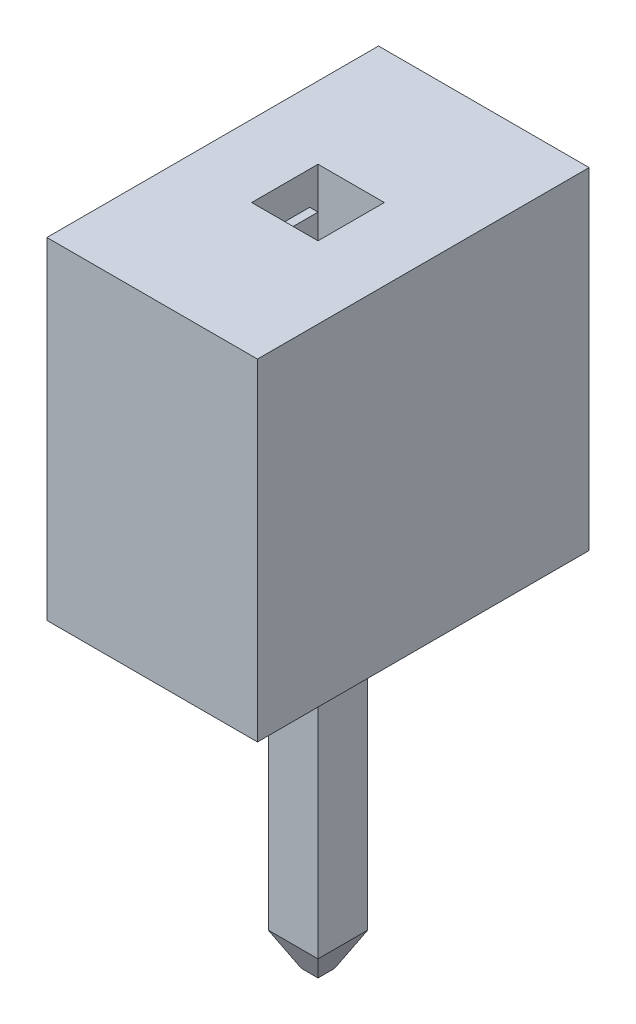
ISO-10303-21;
HEADER;
FILE_DESCRIPTION(('STEP AP214'),'2;1');
FILE_NAME('part.step','',(''),(''),'','','');
FILE_SCHEMA(('AUTOMOTIVE_DESIGN { 1 0 10303 214 1 1 1 1 }'));
ENDSEC;
DATA;
#1=APPLICATION_CONTEXT('core data for automotive mechanical design processes');
#2=APPLICATION_PROTOCOL_DEFINITION('international standard','automotive_design',2000,#1);
#3=PRODUCT_CONTEXT('',#1,'mechanical');
#4=PRODUCT('Part','Part','',(#3));
#5=PRODUCT_RELATED_PRODUCT_CATEGORY('part','',(#4));
#6=PRODUCT_DEFINITION_FORMATION('','',#4);
#7=PRODUCT_DEFINITION_CONTEXT('part definition',#1,'design');
#8=PRODUCT_DEFINITION('design','',#6,#7);
#9=PRODUCT_DEFINITION_SHAPE('','',#8);
#10=(LENGTH_UNIT() NAMED_UNIT(*) SI_UNIT(.MILLI.,.METRE.));
#11=(NAMED_UNIT(*) PLANE_ANGLE_UNIT() SI_UNIT($,.RADIAN.));
#12=(NAMED_UNIT(*) SI_UNIT($,.STERADIAN.) SOLID_ANGLE_UNIT());
#13=UNCERTAINTY_MEASURE_WITH_UNIT(LENGTH_MEASURE(1.E-05),#10,'distance_accuracy_value','');
#14=(GEOMETRIC_REPRESENTATION_CONTEXT(3) GLOBAL_UNCERTAINTY_ASSIGNED_CONTEXT((#13)) GLOBAL_UNIT_ASSIGNED_CONTEXT((#10,
#11,#12)) REPRESENTATION_CONTEXT('',''));
#15=CARTESIAN_POINT('',(0.,0.,0.));
#16=DIRECTION('',(0.,0.,1.));
#17=DIRECTION('',(1.,0.,0.));
#18=AXIS2_PLACEMENT_3D('',#15,#16,#17);
#19=CARTESIAN_POINT('',(0.,0.,0.));
#20=DIRECTION('',(0.,1.,0.));
#21=DIRECTION('',(0.,0.,1.));
#22=AXIS2_PLACEMENT_3D('',#19,#20,#21);
#23=PLANE('',#22);
#24=DIRECTION('',(1.,0.,0.));
#25=VECTOR('',#24,1.);
#26=CARTESIAN_POINT('',(-0.635,0.,1.));
#27=LINE('',#26,#25);
#28=CARTESIAN_POINT('',(-0.635,0.,1.));
#29=VERTEX_POINT('',#28);
#30=CARTESIAN_POINT('',(0.635,0.,1.));
#31=VERTEX_POINT('',#30);
#32=EDGE_CURVE('E332',#29,#31,#27,.T.);
#33=ORIENTED_EDGE('',*,*,#32,.F.);
#34=DIRECTION('',(0.,0.,1.));
#35=VECTOR('',#34,1.);
#36=CARTESIAN_POINT('',(-0.635,0.,-1.));
#37=LINE('',#36,#35);
#38=CARTESIAN_POINT('',(-0.635,0.,-1.));
#39=VERTEX_POINT('',#38);
#40=EDGE_CURVE('E347',#39,#29,#37,.T.);
#41=ORIENTED_EDGE('',*,*,#40,.F.);
#42=DIRECTION('',(-1.,0.,0.));
#43=VECTOR('',#42,1.);
#44=CARTESIAN_POINT('',(-0.635,0.,-1.));
#45=LINE('',#44,#43);
#46=CARTESIAN_POINT('',(0.635,0.,-1.));
#47=VERTEX_POINT('',#46);
#48=EDGE_CURVE('E344',#47,#39,#45,.T.);
#49=ORIENTED_EDGE('',*,*,#48,.F.);
#50=DIRECTION('',(0.,0.,-1.));
#51=VECTOR('',#50,1.);
#52=CARTESIAN_POINT('',(0.635,0.,-1.));
#53=LINE('',#52,#51);
#54=EDGE_CURVE('E326',#31,#47,#53,.T.);
#55=ORIENTED_EDGE('',*,*,#54,.F.);
#56=EDGE_LOOP('',(#33,#41,#49,#55));
#57=FACE_BOUND('',#56,.T.);
#58=DIRECTION('',(0.,0.,-1.));
#59=VECTOR('',#58,1.);
#60=CARTESIAN_POINT('',(-0.15,0.,-0.15));
#61=LINE('',#60,#59);
#62=CARTESIAN_POINT('',(-0.15,0.,0.15));
#63=VERTEX_POINT('',#62);
#64=CARTESIAN_POINT('',(-0.15,0.,-0.15));
#65=VERTEX_POINT('',#64);
#66=EDGE_CURVE('E216',#63,#65,#61,.T.);
#67=ORIENTED_EDGE('',*,*,#66,.F.);
#68=DIRECTION('',(-1.,0.,0.));
#69=VECTOR('',#68,1.);
#70=CARTESIAN_POINT('',(0.635,0.,0.15));
#71=LINE('',#70,#69);
#72=CARTESIAN_POINT('',(-0.2,0.,0.15));
#73=VERTEX_POINT('',#72);
#74=EDGE_CURVE('E212',#63,#73,#71,.T.);
#75=ORIENTED_EDGE('',*,*,#74,.T.);
#76=DIRECTION('',(0.,0.,1.));
#77=VECTOR('',#76,1.);
#78=CARTESIAN_POINT('',(-0.2,0.,-0.2));
#79=LINE('',#78,#77);
#80=CARTESIAN_POINT('',(-0.2,0.,0.2));
#81=VERTEX_POINT('',#80);
#82=EDGE_CURVE('E305',#73,#81,#79,.T.);
#83=ORIENTED_EDGE('',*,*,#82,.T.);
#84=DIRECTION('',(1.,0.,0.));
#85=VECTOR('',#84,1.);
#86=CARTESIAN_POINT('',(-0.2,0.,0.2));
#87=LINE('',#86,#85);
#88=CARTESIAN_POINT('',(0.2,0.,0.2));
#89=VERTEX_POINT('',#88);
#90=EDGE_CURVE('E288',#81,#89,#87,.T.);
#91=ORIENTED_EDGE('',*,*,#90,.T.);
#92=DIRECTION('',(0.,0.,-1.));
#93=VECTOR('',#92,1.);
#94=CARTESIAN_POINT('',(0.2,0.,-0.2));
#95=LINE('',#94,#93);
#96=CARTESIAN_POINT('',(0.2,0.,0.15));
#97=VERTEX_POINT('',#96);
#98=EDGE_CURVE('E209',#89,#97,#95,.T.);
#99=ORIENTED_EDGE('',*,*,#98,.T.);
#100=CARTESIAN_POINT('',(0.15,0.,0.15));
#101=VERTEX_POINT('',#100);
#102=EDGE_CURVE('E193',#97,#101,#71,.T.);
#103=ORIENTED_EDGE('',*,*,#102,.T.);
#104=DIRECTION('',(0.,0.,1.));
#105=VECTOR('',#104,1.);
#106=CARTESIAN_POINT('',(0.15,0.,-0.15));
#107=LINE('',#106,#105);
#108=CARTESIAN_POINT('',(0.15,0.,-0.15));
#109=VERTEX_POINT('',#108);
#110=EDGE_CURVE('E206',#109,#101,#107,.T.);
#111=ORIENTED_EDGE('',*,*,#110,.F.);
#112=DIRECTION('',(1.,0.,0.));
#113=VECTOR('',#112,1.);
#114=CARTESIAN_POINT('',(0.635,0.,-0.15));
#115=LINE('',#114,#113);
#116=CARTESIAN_POINT('',(0.2,0.,-0.15));
#117=VERTEX_POINT('',#116);
#118=EDGE_CURVE('E211',#109,#117,#115,.T.);
#119=ORIENTED_EDGE('',*,*,#118,.T.);
#120=CARTESIAN_POINT('',(0.2,0.,-0.2));
#121=VERTEX_POINT('',#120);
#122=EDGE_CURVE('E283',#117,#121,#95,.T.);
#123=ORIENTED_EDGE('',*,*,#122,.T.);
#124=DIRECTION('',(-1.,0.,0.));
#125=VECTOR('',#124,1.);
#126=CARTESIAN_POINT('',(-0.2,0.,-0.2));
#127=LINE('',#126,#125);
#128=CARTESIAN_POINT('',(-0.2,0.,-0.2));
#129=VERTEX_POINT('',#128);
#130=EDGE_CURVE('E301',#121,#129,#127,.T.);
#131=ORIENTED_EDGE('',*,*,#130,.T.);
#132=CARTESIAN_POINT('',(-0.2,0.,-0.15));
#133=VERTEX_POINT('',#132);
#134=EDGE_CURVE('E306',#129,#133,#79,.T.);
#135=ORIENTED_EDGE('',*,*,#134,.T.);
#136=EDGE_CURVE('E269',#133,#65,#115,.T.);
#137=ORIENTED_EDGE('',*,*,#136,.T.);
#138=EDGE_LOOP('',(#67,#75,#83,#91,#99,#103,#111,#119,#123,#131,#135,#137));
#139=FACE_BOUND('',#138,.T.);
#140=ADVANCED_FACE('F39',(#57,#139),#23,.F.);
#141=CARTESIAN_POINT('',(0.,2.,0.));
#142=DIRECTION('',(0.,1.,0.));
#143=DIRECTION('',(0.,0.,1.));
#144=AXIS2_PLACEMENT_3D('',#141,#142,#143);
#145=PLANE('',#144);
#146=DIRECTION('',(0.,0.,-1.));
#147=VECTOR('',#146,1.);
#148=CARTESIAN_POINT('',(0.635,2.,-1.));
#149=LINE('',#148,#147);
#150=CARTESIAN_POINT('',(0.635,2.,1.));
#151=VERTEX_POINT('',#150);
#152=CARTESIAN_POINT('',(0.635,2.,-1.));
#153=VERTEX_POINT('',#152);
#154=EDGE_CURVE('E327',#151,#153,#149,.T.);
#155=ORIENTED_EDGE('',*,*,#154,.T.);
#156=DIRECTION('',(-1.,0.,0.));
#157=VECTOR('',#156,1.);
#158=CARTESIAN_POINT('',(-0.635,2.,-1.));
#159=LINE('',#158,#157);
#160=CARTESIAN_POINT('',(-0.635,2.,-1.));
#161=VERTEX_POINT('',#160);
#162=EDGE_CURVE('E331',#153,#161,#159,.T.);
#163=ORIENTED_EDGE('',*,*,#162,.T.);
#164=DIRECTION('',(0.,0.,1.));
#165=VECTOR('',#164,1.);
#166=CARTESIAN_POINT('',(-0.635,2.,-1.));
#167=LINE('',#166,#165);
#168=CARTESIAN_POINT('',(-0.635,2.,1.));
#169=VERTEX_POINT('',#168);
#170=EDGE_CURVE('E335',#161,#169,#167,.T.);
#171=ORIENTED_EDGE('',*,*,#170,.T.);
#172=DIRECTION('',(1.,0.,0.));
#173=VECTOR('',#172,1.);
#174=CARTESIAN_POINT('',(-0.635,2.,1.));
#175=LINE('',#174,#173);
#176=EDGE_CURVE('E338',#169,#151,#175,.T.);
#177=ORIENTED_EDGE('',*,*,#176,.T.);
#178=EDGE_LOOP('',(#155,#163,#171,#177));
#179=FACE_BOUND('',#178,.T.);
#180=DIRECTION('',(-1.,0.,0.));
#181=VECTOR('',#180,1.);
#182=CARTESIAN_POINT('',(-0.2,2.,-0.2));
#183=LINE('',#182,#181);
#184=CARTESIAN_POINT('',(0.2,2.,-0.2));
#185=VERTEX_POINT('',#184);
#186=CARTESIAN_POINT('',(-0.2,2.,-0.2));
#187=VERTEX_POINT('',#186);
#188=EDGE_CURVE('E287',#185,#187,#183,.T.);
#189=ORIENTED_EDGE('',*,*,#188,.F.);
#190=DIRECTION('',(0.,0.,-1.));
#191=VECTOR('',#190,1.);
#192=CARTESIAN_POINT('',(0.2,2.,-0.2));
#193=LINE('',#192,#191);
#194=CARTESIAN_POINT('',(0.2,2.,0.2));
#195=VERTEX_POINT('',#194);
#196=EDGE_CURVE('E284',#195,#185,#193,.T.);
#197=ORIENTED_EDGE('',*,*,#196,.F.);
#198=DIRECTION('',(1.,0.,0.));
#199=VECTOR('',#198,1.);
#200=CARTESIAN_POINT('',(-0.2,2.,0.2));
#201=LINE('',#200,#199);
#202=CARTESIAN_POINT('',(-0.2,2.,0.2));
#203=VERTEX_POINT('',#202);
#204=EDGE_CURVE('E295',#203,#195,#201,.T.);
#205=ORIENTED_EDGE('',*,*,#204,.F.);
#206=DIRECTION('',(0.,0.,1.));
#207=VECTOR('',#206,1.);
#208=CARTESIAN_POINT('',(-0.2,2.,-0.2));
#209=LINE('',#208,#207);
#210=EDGE_CURVE('E291',#187,#203,#209,.T.);
#211=ORIENTED_EDGE('',*,*,#210,.F.);
#212=EDGE_LOOP('',(#189,#197,#205,#211));
#213=FACE_BOUND('',#212,.T.);
#214=ADVANCED_FACE('F447',(#179,#213),#145,.T.);
#215=CARTESIAN_POINT('',(0.635,2.,-1.));
#216=DIRECTION('',(-1.,0.,0.));
#217=DIRECTION('',(0.,0.,1.));
#218=AXIS2_PLACEMENT_3D('',#215,#216,#217);
#219=PLANE('',#218);
#220=ORIENTED_EDGE('',*,*,#54,.T.);
#221=DIRECTION('',(0.,-1.,0.));
#222=VECTOR('',#221,1.);
#223=CARTESIAN_POINT('',(0.635,2.,-1.));
#224=LINE('',#223,#222);
#225=EDGE_CURVE('E363',#153,#47,#224,.T.);
#226=ORIENTED_EDGE('',*,*,#225,.F.);
#227=ORIENTED_EDGE('',*,*,#154,.F.);
#228=DIRECTION('',(0.,-1.,0.));
#229=VECTOR('',#228,1.);
#230=CARTESIAN_POINT('',(0.635,2.,1.));
#231=LINE('',#230,#229);
#232=EDGE_CURVE('E341',#151,#31,#231,.T.);
#233=ORIENTED_EDGE('',*,*,#232,.T.);
#234=EDGE_LOOP('',(#220,#226,#227,#233));
#235=FACE_BOUND('',#234,.T.);
#236=ADVANCED_FACE('F453',(#235),#219,.F.);
#237=CARTESIAN_POINT('',(-0.635,2.,-1.));
#238=DIRECTION('',(0.,0.,1.));
#239=DIRECTION('',(1.,0.,0.));
#240=AXIS2_PLACEMENT_3D('',#237,#238,#239);
#241=PLANE('',#240);
#242=ORIENTED_EDGE('',*,*,#48,.T.);
#243=DIRECTION('',(0.,-1.,0.));
#244=VECTOR('',#243,1.);
#245=CARTESIAN_POINT('',(-0.635,2.,-1.));
#246=LINE('',#245,#244);
#247=EDGE_CURVE('E359',#161,#39,#246,.T.);
#248=ORIENTED_EDGE('',*,*,#247,.F.);
#249=ORIENTED_EDGE('',*,*,#162,.F.);
#250=ORIENTED_EDGE('',*,*,#225,.T.);
#251=EDGE_LOOP('',(#242,#248,#249,#250));
#252=FACE_BOUND('',#251,.T.);
#253=ADVANCED_FACE('F467',(#252),#241,.F.);
#254=CARTESIAN_POINT('',(-0.635,2.,-1.));
#255=DIRECTION('',(1.,0.,0.));
#256=DIRECTION('',(0.,0.,-1.));
#257=AXIS2_PLACEMENT_3D('',#254,#255,#256);
#258=PLANE('',#257);
#259=ORIENTED_EDGE('',*,*,#40,.T.);
#260=DIRECTION('',(0.,-1.,0.));
#261=VECTOR('',#260,1.);
#262=CARTESIAN_POINT('',(-0.635,2.,1.));
#263=LINE('',#262,#261);
#264=EDGE_CURVE('E355',#169,#29,#263,.T.);
#265=ORIENTED_EDGE('',*,*,#264,.F.);
#266=ORIENTED_EDGE('',*,*,#170,.F.);
#267=ORIENTED_EDGE('',*,*,#247,.T.);
#268=EDGE_LOOP('',(#259,#265,#266,#267));
#269=FACE_BOUND('',#268,.T.);
#270=ADVANCED_FACE('F463',(#269),#258,.F.);
#271=CARTESIAN_POINT('',(-0.635,2.,1.));
#272=DIRECTION('',(0.,0.,-1.));
#273=DIRECTION('',(-1.,0.,0.));
#274=AXIS2_PLACEMENT_3D('',#271,#272,#273);
#275=PLANE('',#274);
#276=ORIENTED_EDGE('',*,*,#32,.T.);
#277=ORIENTED_EDGE('',*,*,#232,.F.);
#278=ORIENTED_EDGE('',*,*,#176,.F.);
#279=ORIENTED_EDGE('',*,*,#264,.T.);
#280=EDGE_LOOP('',(#276,#277,#278,#279));
#281=FACE_BOUND('',#280,.T.);
#282=ADVANCED_FACE('F459',(#281),#275,.F.);
#283=CARTESIAN_POINT('',(0.2,2.,-0.2));
#284=DIRECTION('',(-1.,0.,0.));
#285=DIRECTION('',(0.,0.,1.));
#286=AXIS2_PLACEMENT_3D('',#283,#284,#285);
#287=PLANE('',#286);
#288=DIRECTION('',(0.,-1.,0.));
#289=VECTOR('',#288,1.);
#290=CARTESIAN_POINT('',(0.2,2.,-0.15));
#291=LINE('',#290,#289);
#292=CARTESIAN_POINT('',(0.2,1.8,-0.15));
#293=VERTEX_POINT('',#292);
#294=EDGE_CURVE('E279',#293,#117,#291,.T.);
#295=ORIENTED_EDGE('',*,*,#294,.F.);
#296=DIRECTION('',(0.,0.,1.));
#297=VECTOR('',#296,1.);
#298=CARTESIAN_POINT('',(0.2,1.8,-0.2));
#299=LINE('',#298,#297);
#300=CARTESIAN_POINT('',(0.2,1.8,0.15));
#301=VERTEX_POINT('',#300);
#302=EDGE_CURVE('E385',#293,#301,#299,.T.);
#303=ORIENTED_EDGE('',*,*,#302,.T.);
#304=DIRECTION('',(0.,1.,0.));
#305=VECTOR('',#304,1.);
#306=CARTESIAN_POINT('',(0.2,2.,0.15));
#307=LINE('',#306,#305);
#308=EDGE_CURVE('E272',#97,#301,#307,.T.);
#309=ORIENTED_EDGE('',*,*,#308,.F.);
#310=ORIENTED_EDGE('',*,*,#98,.F.);
#311=DIRECTION('',(0.,-1.,0.));
#312=VECTOR('',#311,1.);
#313=CARTESIAN_POINT('',(0.2,2.,0.2));
#314=LINE('',#313,#312);
#315=EDGE_CURVE('E298',#195,#89,#314,.T.);
#316=ORIENTED_EDGE('',*,*,#315,.F.);
#317=ORIENTED_EDGE('',*,*,#196,.T.);
#318=DIRECTION('',(0.,-1.,0.));
#319=VECTOR('',#318,1.);
#320=CARTESIAN_POINT('',(0.2,2.,-0.2));
#321=LINE('',#320,#319);
#322=EDGE_CURVE('E322',#185,#121,#321,.T.);
#323=ORIENTED_EDGE('',*,*,#322,.T.);
#324=ORIENTED_EDGE('',*,*,#122,.F.);
#325=EDGE_LOOP('',(#295,#303,#309,#310,#316,#317,#323,#324));
#326=FACE_BOUND('',#325,.T.);
#327=ADVANCED_FACE('F462',(#326),#287,.T.);
#328=CARTESIAN_POINT('',(-0.2,2.,-0.2));
#329=DIRECTION('',(0.,0.,1.));
#330=DIRECTION('',(1.,0.,0.));
#331=AXIS2_PLACEMENT_3D('',#328,#329,#330);
#332=PLANE('',#331);
#333=ORIENTED_EDGE('',*,*,#130,.F.);
#334=ORIENTED_EDGE('',*,*,#322,.F.);
#335=ORIENTED_EDGE('',*,*,#188,.T.);
#336=DIRECTION('',(0.,-1.,0.));
#337=VECTOR('',#336,1.);
#338=CARTESIAN_POINT('',(-0.2,2.,-0.2));
#339=LINE('',#338,#337);
#340=EDGE_CURVE('E319',#187,#129,#339,.T.);
#341=ORIENTED_EDGE('',*,*,#340,.T.);
#342=EDGE_LOOP('',(#333,#334,#335,#341));
#343=FACE_BOUND('',#342,.T.);
#344=ADVANCED_FACE('F609',(#343),#332,.T.);
#345=CARTESIAN_POINT('',(-0.2,2.,-0.2));
#346=DIRECTION('',(1.,0.,0.));
#347=DIRECTION('',(0.,0.,-1.));
#348=AXIS2_PLACEMENT_3D('',#345,#346,#347);
#349=PLANE('',#348);
#350=DIRECTION('',(0.,0.,1.));
#351=VECTOR('',#350,1.);
#352=CARTESIAN_POINT('',(-0.2,1.8,-0.2));
#353=LINE('',#352,#351);
#354=CARTESIAN_POINT('',(-0.2,1.8,-0.15));
#355=VERTEX_POINT('',#354);
#356=CARTESIAN_POINT('',(-0.2,1.8,0.15));
#357=VERTEX_POINT('',#356);
#358=EDGE_CURVE('E377',#355,#357,#353,.T.);
#359=ORIENTED_EDGE('',*,*,#358,.F.);
#360=DIRECTION('',(0.,1.,0.));
#361=VECTOR('',#360,1.);
#362=CARTESIAN_POINT('',(-0.2,2.,-0.15));
#363=LINE('',#362,#361);
#364=EDGE_CURVE('E371',#133,#355,#363,.T.);
#365=ORIENTED_EDGE('',*,*,#364,.F.);
#366=ORIENTED_EDGE('',*,*,#134,.F.);
#367=ORIENTED_EDGE('',*,*,#340,.F.);
#368=ORIENTED_EDGE('',*,*,#210,.T.);
#369=DIRECTION('',(0.,-1.,0.));
#370=VECTOR('',#369,1.);
#371=CARTESIAN_POINT('',(-0.2,2.,0.2));
#372=LINE('',#371,#370);
#373=EDGE_CURVE('E315',#203,#81,#372,.T.);
#374=ORIENTED_EDGE('',*,*,#373,.T.);
#375=ORIENTED_EDGE('',*,*,#82,.F.);
#376=DIRECTION('',(0.,-1.,0.));
#377=VECTOR('',#376,1.);
#378=CARTESIAN_POINT('',(-0.2,2.,0.15));
#379=LINE('',#378,#377);
#380=EDGE_CURVE('E367',#357,#73,#379,.T.);
#381=ORIENTED_EDGE('',*,*,#380,.F.);
#382=EDGE_LOOP('',(#359,#365,#366,#367,#368,#374,#375,#381));
#383=FACE_BOUND('',#382,.T.);
#384=ADVANCED_FACE('F604',(#383),#349,.T.);
#385=CARTESIAN_POINT('',(-0.2,2.,0.2));
#386=DIRECTION('',(0.,0.,-1.));
#387=DIRECTION('',(-1.,0.,0.));
#388=AXIS2_PLACEMENT_3D('',#385,#386,#387);
#389=PLANE('',#388);
#390=ORIENTED_EDGE('',*,*,#90,.F.);
#391=ORIENTED_EDGE('',*,*,#373,.F.);
#392=ORIENTED_EDGE('',*,*,#204,.T.);
#393=ORIENTED_EDGE('',*,*,#315,.T.);
#394=EDGE_LOOP('',(#390,#391,#392,#393));
#395=FACE_BOUND('',#394,.T.);
#396=ADVANCED_FACE('F541',(#395),#389,.T.);
#397=CARTESIAN_POINT('',(0.635,0.1,-0.15));
#398=DIRECTION('',(0.,0.,-1.));
#399=DIRECTION('',(-1.,0.,0.));
#400=AXIS2_PLACEMENT_3D('',#397,#398,#399);
#401=PLANE('',#400);
#402=DIRECTION('',(0.,1.,0.));
#403=VECTOR('',#402,1.);
#404=CARTESIAN_POINT('',(0.15,-2.,-0.15));
#405=LINE('',#404,#403);
#406=CARTESIAN_POINT('',(0.15,-1.8,-0.15));
#407=VERTEX_POINT('',#406);
#408=EDGE_CURVE('E199',#407,#109,#405,.T.);
#409=ORIENTED_EDGE('',*,*,#408,.F.);
#410=DIRECTION('',(-1.,0.,0.));
#411=VECTOR('',#410,1.);
#412=CARTESIAN_POINT('',(0.635,-1.8,-0.15));
#413=LINE('',#412,#411);
#414=CARTESIAN_POINT('',(-0.15,-1.8,-0.15));
#415=VERTEX_POINT('',#414);
#416=EDGE_CURVE('E49',#407,#415,#413,.T.);
#417=ORIENTED_EDGE('',*,*,#416,.T.);
#418=DIRECTION('',(0.,1.,0.));
#419=VECTOR('',#418,1.);
#420=CARTESIAN_POINT('',(-0.15,-2.,-0.15));
#421=LINE('',#420,#419);
#422=EDGE_CURVE('E226',#415,#65,#421,.T.);
#423=ORIENTED_EDGE('',*,*,#422,.T.);
#424=ORIENTED_EDGE('',*,*,#136,.F.);
#425=ORIENTED_EDGE('',*,*,#364,.T.);
#426=DIRECTION('',(-1.,0.,0.));
#427=VECTOR('',#426,1.);
#428=CARTESIAN_POINT('',(-0.35,1.8,-0.15));
#429=LINE('',#428,#427);
#430=CARTESIAN_POINT('',(-0.15,1.8,-0.15));
#431=VERTEX_POINT('',#430);
#432=EDGE_CURVE('E255',#431,#355,#429,.T.);
#433=ORIENTED_EDGE('',*,*,#432,.F.);
#434=DIRECTION('',(0.,1.,0.));
#435=VECTOR('',#434,1.);
#436=CARTESIAN_POINT('',(-0.15,0.,-0.15));
#437=LINE('',#436,#435);
#438=CARTESIAN_POINT('',(-0.15,0.1,-0.15));
#439=VERTEX_POINT('',#438);
#440=EDGE_CURVE('E260',#439,#431,#437,.T.);
#441=ORIENTED_EDGE('',*,*,#440,.F.);
#442=DIRECTION('',(1.,0.,0.));
#443=VECTOR('',#442,1.);
#444=CARTESIAN_POINT('',(0.635,0.1,-0.15));
#445=LINE('',#444,#443);
#446=CARTESIAN_POINT('',(0.15,0.1,-0.15));
#447=VERTEX_POINT('',#446);
#448=EDGE_CURVE('E268',#439,#447,#445,.T.);
#449=ORIENTED_EDGE('',*,*,#448,.T.);
#450=DIRECTION('',(0.,1.,0.));
#451=VECTOR('',#450,1.);
#452=CARTESIAN_POINT('',(0.15,0.,-0.15));
#453=LINE('',#452,#451);
#454=CARTESIAN_POINT('',(0.15,1.8,-0.15));
#455=VERTEX_POINT('',#454);
#456=EDGE_CURVE('E242',#447,#455,#453,.T.);
#457=ORIENTED_EDGE('',*,*,#456,.T.);
#458=DIRECTION('',(-1.,0.,0.));
#459=VECTOR('',#458,1.);
#460=CARTESIAN_POINT('',(0.35,1.8,-0.15));
#461=LINE('',#460,#459);
#462=EDGE_CURVE('E237',#293,#455,#461,.T.);
#463=ORIENTED_EDGE('',*,*,#462,.F.);
#464=ORIENTED_EDGE('',*,*,#294,.T.);
#465=ORIENTED_EDGE('',*,*,#118,.F.);
#466=EDGE_LOOP('',(#409,#417,#423,#424,#425,#433,#441,#449,#457,#463,#464,#465));
#467=FACE_BOUND('',#466,.T.);
#468=ADVANCED_FACE('F528',(#467),#401,.T.);
#469=CARTESIAN_POINT('',(0.635,0.1,0.15));
#470=DIRECTION('',(0.,0.,1.));
#471=DIRECTION('',(1.,0.,0.));
#472=AXIS2_PLACEMENT_3D('',#469,#470,#471);
#473=PLANE('',#472);
#474=DIRECTION('',(0.,1.,0.));
#475=VECTOR('',#474,1.);
#476=CARTESIAN_POINT('',(-0.15,-2.,0.15));
#477=LINE('',#476,#475);
#478=CARTESIAN_POINT('',(-0.15,-1.8,0.15));
#479=VERTEX_POINT('',#478);
#480=EDGE_CURVE('E200',#479,#63,#477,.T.);
#481=ORIENTED_EDGE('',*,*,#480,.F.);
#482=DIRECTION('',(1.,0.,0.));
#483=VECTOR('',#482,1.);
#484=CARTESIAN_POINT('',(0.635,-1.8,0.15));
#485=LINE('',#484,#483);
#486=CARTESIAN_POINT('',(0.15,-1.8,0.15));
#487=VERTEX_POINT('',#486);
#488=EDGE_CURVE('E196',#479,#487,#485,.T.);
#489=ORIENTED_EDGE('',*,*,#488,.T.);
#490=DIRECTION('',(0.,1.,0.));
#491=VECTOR('',#490,1.);
#492=CARTESIAN_POINT('',(0.15,-2.,0.15));
#493=LINE('',#492,#491);
#494=EDGE_CURVE('E189',#487,#101,#493,.T.);
#495=ORIENTED_EDGE('',*,*,#494,.T.);
#496=ORIENTED_EDGE('',*,*,#102,.F.);
#497=ORIENTED_EDGE('',*,*,#308,.T.);
#498=DIRECTION('',(1.,0.,0.));
#499=VECTOR('',#498,1.);
#500=CARTESIAN_POINT('',(0.35,1.8,0.15));
#501=LINE('',#500,#499);
#502=CARTESIAN_POINT('',(0.15,1.8,0.15));
#503=VERTEX_POINT('',#502);
#504=EDGE_CURVE('E233',#503,#301,#501,.T.);
#505=ORIENTED_EDGE('',*,*,#504,.F.);
#506=DIRECTION('',(0.,1.,0.));
#507=VECTOR('',#506,1.);
#508=CARTESIAN_POINT('',(0.15,0.,0.15));
#509=LINE('',#508,#507);
#510=CARTESIAN_POINT('',(0.15,0.1,0.15));
#511=VERTEX_POINT('',#510);
#512=EDGE_CURVE('E241',#511,#503,#509,.T.);
#513=ORIENTED_EDGE('',*,*,#512,.F.);
#514=DIRECTION('',(-1.,0.,0.));
#515=VECTOR('',#514,1.);
#516=CARTESIAN_POINT('',(0.635,0.1,0.15));
#517=LINE('',#516,#515);
#518=CARTESIAN_POINT('',(-0.15,0.1,0.15));
#519=VERTEX_POINT('',#518);
#520=EDGE_CURVE('E265',#511,#519,#517,.T.);
#521=ORIENTED_EDGE('',*,*,#520,.T.);
#522=DIRECTION('',(0.,1.,0.));
#523=VECTOR('',#522,1.);
#524=CARTESIAN_POINT('',(-0.15,0.,0.15));
#525=LINE('',#524,#523);
#526=CARTESIAN_POINT('',(-0.15,1.8,0.15));
#527=VERTEX_POINT('',#526);
#528=EDGE_CURVE('E259',#519,#527,#525,.T.);
#529=ORIENTED_EDGE('',*,*,#528,.T.);
#530=DIRECTION('',(1.,0.,0.));
#531=VECTOR('',#530,1.);
#532=CARTESIAN_POINT('',(-0.35,1.8,0.15));
#533=LINE('',#532,#531);
#534=EDGE_CURVE('E245',#357,#527,#533,.T.);
#535=ORIENTED_EDGE('',*,*,#534,.F.);
#536=ORIENTED_EDGE('',*,*,#380,.T.);
#537=ORIENTED_EDGE('',*,*,#74,.F.);
#538=EDGE_LOOP('',(#481,#489,#495,#496,#497,#505,#513,#521,#529,#535,#536,#537));
#539=FACE_BOUND('',#538,.T.);
#540=ADVANCED_FACE('F192',(#539),#473,.T.);
#541=CARTESIAN_POINT('',(0.,0.1,0.));
#542=DIRECTION('',(0.,1.,0.));
#543=DIRECTION('',(0.,0.,1.));
#544=AXIS2_PLACEMENT_3D('',#541,#542,#543);
#545=PLANE('',#544);
#546=DIRECTION('',(0.,0.,1.));
#547=VECTOR('',#546,1.);
#548=CARTESIAN_POINT('',(0.15,0.1,0.));
#549=LINE('',#548,#547);
#550=EDGE_CURVE('E381',#447,#511,#549,.T.);
#551=ORIENTED_EDGE('',*,*,#550,.F.);
#552=ORIENTED_EDGE('',*,*,#448,.F.);
#553=DIRECTION('',(0.,0.,-1.));
#554=VECTOR('',#553,1.);
#555=CARTESIAN_POINT('',(-0.15,0.1,0.));
#556=LINE('',#555,#554);
#557=EDGE_CURVE('E374',#519,#439,#556,.T.);
#558=ORIENTED_EDGE('',*,*,#557,.F.);
#559=ORIENTED_EDGE('',*,*,#520,.F.);
#560=EDGE_LOOP('',(#551,#552,#558,#559));
#561=FACE_BOUND('',#560,.T.);
#562=ADVANCED_FACE('F527',(#561),#545,.T.);
#563=CARTESIAN_POINT('',(-0.15,0.,-0.15));
#564=DIRECTION('',(1.,0.,0.));
#565=DIRECTION('',(0.,0.,-1.));
#566=AXIS2_PLACEMENT_3D('',#563,#564,#565);
#567=PLANE('',#566);
#568=ORIENTED_EDGE('',*,*,#528,.F.);
#569=ORIENTED_EDGE('',*,*,#557,.T.);
#570=ORIENTED_EDGE('',*,*,#440,.T.);
#571=DIRECTION('',(0.,0.,-1.));
#572=VECTOR('',#571,1.);
#573=CARTESIAN_POINT('',(-0.15,1.8,-0.15));
#574=LINE('',#573,#572);
#575=EDGE_CURVE('E251',#527,#431,#574,.T.);
#576=ORIENTED_EDGE('',*,*,#575,.F.);
#577=EDGE_LOOP('',(#568,#569,#570,#576));
#578=FACE_BOUND('',#577,.T.);
#579=ADVANCED_FACE('F579',(#578),#567,.T.);
#580=CARTESIAN_POINT('',(0.,1.8,0.));
#581=DIRECTION('',(0.,1.,0.));
#582=DIRECTION('',(0.,0.,1.));
#583=AXIS2_PLACEMENT_3D('',#580,#581,#582);
#584=PLANE('',#583);
#585=ORIENTED_EDGE('',*,*,#432,.T.);
#586=ORIENTED_EDGE('',*,*,#358,.T.);
#587=ORIENTED_EDGE('',*,*,#534,.T.);
#588=ORIENTED_EDGE('',*,*,#575,.T.);
#589=EDGE_LOOP('',(#585,#586,#587,#588));
#590=FACE_BOUND('',#589,.T.);
#591=ADVANCED_FACE('F568',(#590),#584,.T.);
#592=CARTESIAN_POINT('',(0.15,0.,-0.15));
#593=DIRECTION('',(-1.,0.,0.));
#594=DIRECTION('',(0.,0.,1.));
#595=AXIS2_PLACEMENT_3D('',#592,#593,#594);
#596=PLANE('',#595);
#597=ORIENTED_EDGE('',*,*,#456,.F.);
#598=ORIENTED_EDGE('',*,*,#550,.T.);
#599=ORIENTED_EDGE('',*,*,#512,.T.);
#600=DIRECTION('',(0.,0.,1.));
#601=VECTOR('',#600,1.);
#602=CARTESIAN_POINT('',(0.15,1.8,-0.15));
#603=LINE('',#602,#601);
#604=EDGE_CURVE('E229',#455,#503,#603,.T.);
#605=ORIENTED_EDGE('',*,*,#604,.F.);
#606=EDGE_LOOP('',(#597,#598,#599,#605));
#607=FACE_BOUND('',#606,.T.);
#608=ADVANCED_FACE('F558',(#607),#596,.T.);
#609=CARTESIAN_POINT('',(0.,1.8,0.));
#610=DIRECTION('',(0.,-1.,0.));
#611=DIRECTION('',(0.,0.,-1.));
#612=AXIS2_PLACEMENT_3D('',#609,#610,#611);
#613=PLANE('',#612);
#614=ORIENTED_EDGE('',*,*,#302,.F.);
#615=ORIENTED_EDGE('',*,*,#462,.T.);
#616=ORIENTED_EDGE('',*,*,#604,.T.);
#617=ORIENTED_EDGE('',*,*,#504,.T.);
#618=EDGE_LOOP('',(#614,#615,#616,#617));
#619=FACE_BOUND('',#618,.T.);
#620=ADVANCED_FACE('F518',(#619),#613,.F.);
#621=CARTESIAN_POINT('',(-0.15,-2.,-0.15));
#622=DIRECTION('',(1.,0.,0.));
#623=DIRECTION('',(0.,0.,-1.));
#624=AXIS2_PLACEMENT_3D('',#621,#622,#623);
#625=PLANE('',#624);
#626=ORIENTED_EDGE('',*,*,#422,.F.);
#627=DIRECTION('',(0.,0.,1.));
#628=VECTOR('',#627,1.);
#629=CARTESIAN_POINT('',(-0.15,-1.8,0.15));
#630=LINE('',#629,#628);
#631=EDGE_CURVE('E11',#415,#479,#630,.T.);
#632=ORIENTED_EDGE('',*,*,#631,.T.);
#633=ORIENTED_EDGE('',*,*,#480,.T.);
#634=ORIENTED_EDGE('',*,*,#66,.T.);
#635=EDGE_LOOP('',(#626,#632,#633,#634));
#636=FACE_BOUND('',#635,.T.);
#637=ADVANCED_FACE('F432',(#636),#625,.F.);
#638=CARTESIAN_POINT('',(0.15,-2.,-0.15));
#639=DIRECTION('',(-1.,0.,0.));
#640=DIRECTION('',(0.,0.,1.));
#641=AXIS2_PLACEMENT_3D('',#638,#639,#640);
#642=PLANE('',#641);
#643=ORIENTED_EDGE('',*,*,#494,.F.);
#644=DIRECTION('',(0.,0.,-1.));
#645=VECTOR('',#644,1.);
#646=CARTESIAN_POINT('',(0.15,-1.8,-0.15));
#647=LINE('',#646,#645);
#648=EDGE_CURVE('E64',#487,#407,#647,.T.);
#649=ORIENTED_EDGE('',*,*,#648,.T.);
#650=ORIENTED_EDGE('',*,*,#408,.T.);
#651=ORIENTED_EDGE('',*,*,#110,.T.);
#652=EDGE_LOOP('',(#643,#649,#650,#651));
#653=FACE_BOUND('',#652,.T.);
#654=ADVANCED_FACE('F214',(#653),#642,.F.);
#655=CARTESIAN_POINT('',(0.,-2.,0.));
#656=DIRECTION('',(0.,-1.,0.));
#657=DIRECTION('',(0.,0.,-1.));
#658=AXIS2_PLACEMENT_3D('',#655,#656,#657);
#659=PLANE('',#658);
#660=DIRECTION('',(0.,0.,1.));
#661=VECTOR('',#660,1.);
#662=CARTESIAN_POINT('',(0.0499999999999998,-2.,0.15));
#663=LINE('',#662,#661);
#664=CARTESIAN_POINT('',(0.0499999999999998,-2.,-0.0499999999999997));
#665=VERTEX_POINT('',#664);
#666=CARTESIAN_POINT('',(0.0499999999999998,-2.,0.0499999999999998));
#667=VERTEX_POINT('',#666);
#668=EDGE_CURVE('E395',#665,#667,#663,.T.);
#669=ORIENTED_EDGE('',*,*,#668,.T.);
#670=DIRECTION('',(-1.,0.,0.));
#671=VECTOR('',#670,1.);
#672=CARTESIAN_POINT('',(0.,-2.,0.0499999999999998));
#673=LINE('',#672,#671);
#674=CARTESIAN_POINT('',(-0.0499999999999997,-2.,0.0499999999999997));
#675=VERTEX_POINT('',#674);
#676=EDGE_CURVE('E398',#667,#675,#673,.T.);
#677=ORIENTED_EDGE('',*,*,#676,.T.);
#678=DIRECTION('',(0.,0.,-1.));
#679=VECTOR('',#678,1.);
#680=CARTESIAN_POINT('',(-0.0499999999999997,-2.,-0.15));
#681=LINE('',#680,#679);
#682=CARTESIAN_POINT('',(-0.0499999999999997,-2.,-0.0499999999999997));
#683=VERTEX_POINT('',#682);
#684=EDGE_CURVE('E389',#675,#683,#681,.T.);
#685=ORIENTED_EDGE('',*,*,#684,.T.);
#686=DIRECTION('',(1.,0.,0.));
#687=VECTOR('',#686,1.);
#688=CARTESIAN_POINT('',(0.,-2.,-0.0499999999999997));
#689=LINE('',#688,#687);
#690=EDGE_CURVE('E392',#683,#665,#689,.T.);
#691=ORIENTED_EDGE('',*,*,#690,.T.);
#692=EDGE_LOOP('',(#669,#677,#685,#691));
#693=FACE_BOUND('',#692,.T.);
#694=ADVANCED_FACE('F438',(#693),#659,.T.);
#695=CARTESIAN_POINT('',(0.,-2.,-0.0499999999999997));
#696=DIRECTION('',(0.,0.447213595499955,0.894427190999918));
#697=DIRECTION('',(1.,0.,0.));
#698=AXIS2_PLACEMENT_3D('',#695,#696,#697);
#699=PLANE('',#698);
#700=DIRECTION('',(-0.408248290463861,0.816496580927728,-0.408248290463861));
#701=VECTOR('',#700,1.);
#702=CARTESIAN_POINT('',(-0.0416666666666665,-2.01666666666667,-0.0416666666666665));
#703=LINE('',#702,#701);
#704=EDGE_CURVE('E413',#415,#683,#703,.F.);
#705=ORIENTED_EDGE('',*,*,#704,.F.);
#706=ORIENTED_EDGE('',*,*,#416,.F.);
#707=DIRECTION('',(0.408248290463861,0.816496580927728,-0.408248290463861));
#708=VECTOR('',#707,1.);
#709=CARTESIAN_POINT('',(0.0416666666666666,-2.01666666666667,-0.0416666666666665));
#710=LINE('',#709,#708);
#711=EDGE_CURVE('E43',#665,#407,#710,.T.);
#712=ORIENTED_EDGE('',*,*,#711,.F.);
#713=ORIENTED_EDGE('',*,*,#690,.F.);
#714=EDGE_LOOP('',(#705,#706,#712,#713));
#715=FACE_BOUND('',#714,.T.);
#716=ADVANCED_FACE('F41',(#715),#699,.F.);
#717=CARTESIAN_POINT('',(0.0499999999999998,-2.,0.));
#718=DIRECTION('',(0.894427190999918,-0.447213595499955,0.));
#719=DIRECTION('',(0.,0.,-1.));
#720=AXIS2_PLACEMENT_3D('',#717,#718,#719);
#721=PLANE('',#720);
#722=ORIENTED_EDGE('',*,*,#711,.T.);
#723=ORIENTED_EDGE('',*,*,#648,.F.);
#724=DIRECTION('',(0.408248290463861,0.816496580927728,0.408248290463861));
#725=VECTOR('',#724,1.);
#726=CARTESIAN_POINT('',(0.0416666666666666,-2.01666666666667,0.0416666666666666));
#727=LINE('',#726,#725);
#728=EDGE_CURVE('E411',#667,#487,#727,.T.);
#729=ORIENTED_EDGE('',*,*,#728,.F.);
#730=ORIENTED_EDGE('',*,*,#668,.F.);
#731=EDGE_LOOP('',(#722,#723,#729,#730));
#732=FACE_BOUND('',#731,.T.);
#733=ADVANCED_FACE('F425',(#732),#721,.T.);
#734=CARTESIAN_POINT('',(-0.0499999999999997,-2.,0.));
#735=DIRECTION('',(-0.894427190999918,-0.447213595499955,0.));
#736=DIRECTION('',(0.,0.,1.));
#737=AXIS2_PLACEMENT_3D('',#734,#735,#736);
#738=PLANE('',#737);
#739=ORIENTED_EDGE('',*,*,#704,.T.);
#740=ORIENTED_EDGE('',*,*,#684,.F.);
#741=DIRECTION('',(0.408248290463861,-0.816496580927728,-0.408248290463861));
#742=VECTOR('',#741,1.);
#743=CARTESIAN_POINT('',(-0.0416666666666665,-2.01666666666667,0.0416666666666666));
#744=LINE('',#743,#742);
#745=EDGE_CURVE('E408',#479,#675,#744,.T.);
#746=ORIENTED_EDGE('',*,*,#745,.F.);
#747=ORIENTED_EDGE('',*,*,#631,.F.);
#748=EDGE_LOOP('',(#739,#740,#746,#747));
#749=FACE_BOUND('',#748,.T.);
#750=ADVANCED_FACE('F430',(#749),#738,.T.);
#751=CARTESIAN_POINT('',(0.,-2.,0.0499999999999998));
#752=DIRECTION('',(0.,0.447213595499955,-0.894427190999918));
#753=DIRECTION('',(-1.,0.,0.));
#754=AXIS2_PLACEMENT_3D('',#751,#752,#753);
#755=PLANE('',#754);
#756=ORIENTED_EDGE('',*,*,#728,.T.);
#757=ORIENTED_EDGE('',*,*,#488,.F.);
#758=ORIENTED_EDGE('',*,*,#745,.T.);
#759=ORIENTED_EDGE('',*,*,#676,.F.);
#760=EDGE_LOOP('',(#756,#757,#758,#759));
#761=FACE_BOUND('',#760,.T.);
#762=ADVANCED_FACE('F435',(#761),#755,.F.);
#763=CLOSED_SHELL('',(#140,#214,#236,#253,#270,#282,#327,#344,#384,#396,#468,#540,#562,#579,
#591,#608,#620,#637,#654,#694,#716,#733,#750,#762));
#764=MANIFOLD_SOLID_BREP('B2',#763);
#765=ADVANCED_BREP_SHAPE_REPRESENTATION('',(#18,#764),#14);
#766=SHAPE_DEFINITION_REPRESENTATION(#9,#765);
ENDSEC;
END-ISO-10303-21;
